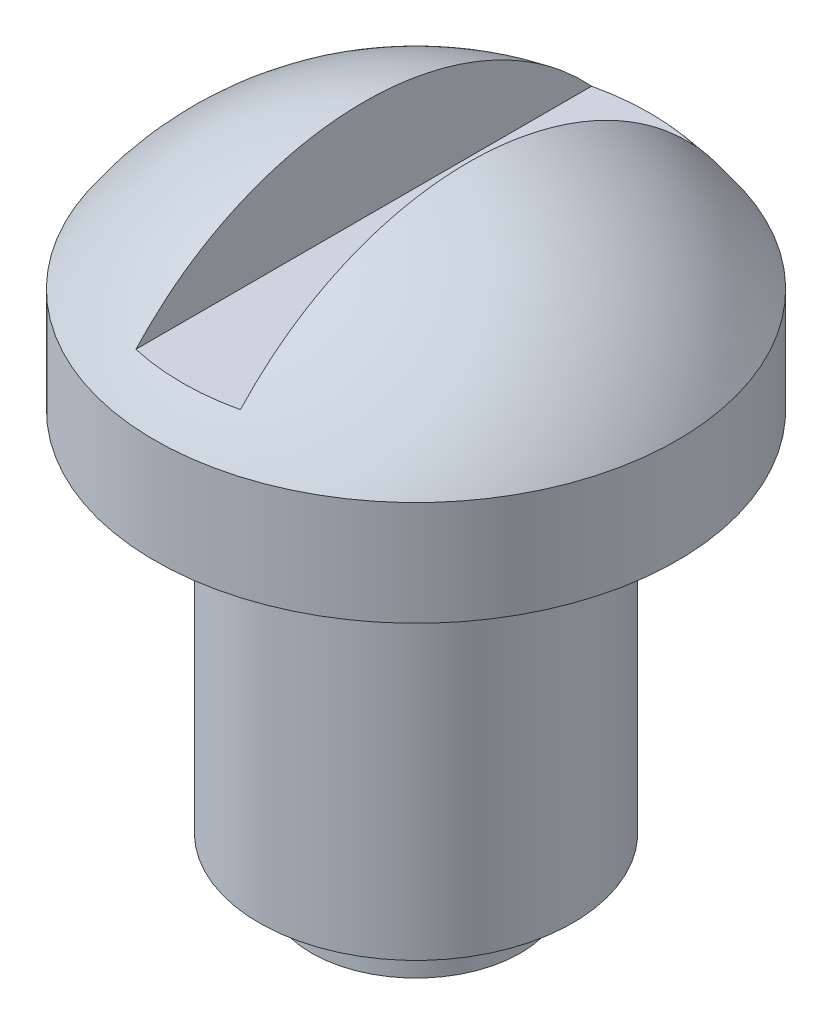
ISO-10303-21;
HEADER;
FILE_DESCRIPTION(('STEP AP214'),'2;1');
FILE_NAME('part.step','',(''),(''),'','','');
FILE_SCHEMA(('AUTOMOTIVE_DESIGN { 1 0 10303 214 1 1 1 1 }'));
ENDSEC;
DATA;
#1=APPLICATION_CONTEXT('core data for automotive mechanical design processes');
#2=APPLICATION_PROTOCOL_DEFINITION('international standard','automotive_design',2000,#1);
#3=PRODUCT_CONTEXT('',#1,'mechanical');
#4=PRODUCT('Part','Part','',(#3));
#5=PRODUCT_RELATED_PRODUCT_CATEGORY('part','',(#4));
#6=PRODUCT_DEFINITION_FORMATION('','',#4);
#7=PRODUCT_DEFINITION_CONTEXT('part definition',#1,'design');
#8=PRODUCT_DEFINITION('design','',#6,#7);
#9=PRODUCT_DEFINITION_SHAPE('','',#8);
#10=(LENGTH_UNIT() NAMED_UNIT(*) SI_UNIT(.MILLI.,.METRE.));
#11=(NAMED_UNIT(*) PLANE_ANGLE_UNIT() SI_UNIT($,.RADIAN.));
#12=(NAMED_UNIT(*) SI_UNIT($,.STERADIAN.) SOLID_ANGLE_UNIT());
#13=UNCERTAINTY_MEASURE_WITH_UNIT(LENGTH_MEASURE(1.E-05),#10,'distance_accuracy_value','');
#14=(GEOMETRIC_REPRESENTATION_CONTEXT(3) GLOBAL_UNCERTAINTY_ASSIGNED_CONTEXT((#13)) GLOBAL_UNIT_ASSIGNED_CONTEXT((#10,
#11,#12)) REPRESENTATION_CONTEXT('',''));
#15=CARTESIAN_POINT('',(0.,0.,0.));
#16=DIRECTION('',(0.,0.,1.));
#17=DIRECTION('',(1.,0.,0.));
#18=AXIS2_PLACEMENT_3D('',#15,#16,#17);
#19=CARTESIAN_POINT('',(0.,-6.,0.));
#20=DIRECTION('',(0.,1.,0.));
#21=DIRECTION('',(1.,0.,0.));
#22=AXIS2_PLACEMENT_3D('',#19,#20,#21);
#23=SPHERICAL_SURFACE('',#22,6.);
#24=CARTESIAN_POINT('',(0.,-2.,0.));
#25=DIRECTION('',(0.,-1.,0.));
#26=DIRECTION('',(0.,0.,-1.));
#27=AXIS2_PLACEMENT_3D('',#24,#25,#26);
#28=CIRCLE('',#27,4.47213595499958);
#29=CARTESIAN_POINT('',(-1.,-2.,-4.35889894354067));
#30=VERTEX_POINT('',#29);
#31=CARTESIAN_POINT('',(1.,-2.,-4.35889894354067));
#32=VERTEX_POINT('',#31);
#33=EDGE_CURVE('E71',#30,#32,#28,.T.);
#34=ORIENTED_EDGE('',*,*,#33,.T.);
#35=CARTESIAN_POINT('',(1.,-6.,0.));
#36=DIRECTION('',(1.,0.,0.));
#37=DIRECTION('',(0.,1.,0.));
#38=AXIS2_PLACEMENT_3D('',#35,#36,#37);
#39=CIRCLE('',#38,5.91607978309962);
#40=CARTESIAN_POINT('',(1.,-2.,4.35889894354067));
#41=VERTEX_POINT('',#40);
#42=EDGE_CURVE('E11',#32,#41,#39,.T.);
#43=ORIENTED_EDGE('',*,*,#42,.T.);
#44=CARTESIAN_POINT('',(-1.,-2.,4.35889894354067));
#45=VERTEX_POINT('',#44);
#46=EDGE_CURVE('E47',#41,#45,#28,.T.);
#47=ORIENTED_EDGE('',*,*,#46,.T.);
#48=CARTESIAN_POINT('',(-1.,-6.,0.));
#49=DIRECTION('',(-1.,0.,0.));
#50=DIRECTION('',(0.,-1.,0.));
#51=AXIS2_PLACEMENT_3D('',#48,#49,#50);
#52=CIRCLE('',#51,5.91607978309962);
#53=EDGE_CURVE('E66',#45,#30,#52,.T.);
#54=ORIENTED_EDGE('',*,*,#53,.T.);
#55=EDGE_LOOP('',(#34,#43,#47,#54));
#56=FACE_BOUND('',#55,.T.);
#57=CARTESIAN_POINT('',(0.,-2.6833752096446,0.));
#58=DIRECTION('',(0.,1.,0.));
#59=DIRECTION('',(-1.,0.,0.));
#60=AXIS2_PLACEMENT_3D('',#57,#58,#59);
#61=CIRCLE('',#60,5.);
#62=CARTESIAN_POINT('',(-5.,-2.6833752096446,0.));
#63=VERTEX_POINT('',#62);
#64=EDGE_CURVE('E72',#63,#63,#61,.T.);
#65=ORIENTED_EDGE('',*,*,#64,.T.);
#66=EDGE_LOOP('',(#65));
#67=FACE_BOUND('',#66,.T.);
#68=ADVANCED_FACE('F39',(#56,#67),#23,.T.);
#69=CARTESIAN_POINT('',(0.,0.,0.));
#70=DIRECTION('',(0.,1.,0.));
#71=DIRECTION('',(-1.,0.,0.));
#72=AXIS2_PLACEMENT_3D('',#69,#70,#71);
#73=CYLINDRICAL_SURFACE('',#72,5.);
#74=ORIENTED_EDGE('',*,*,#64,.F.);
#75=EDGE_LOOP('',(#74));
#76=FACE_BOUND('',#75,.T.);
#77=CARTESIAN_POINT('',(0.,-4.6833752096446,0.));
#78=DIRECTION('',(0.,1.,0.));
#79=DIRECTION('',(-1.,0.,0.));
#80=AXIS2_PLACEMENT_3D('',#77,#78,#79);
#81=CIRCLE('',#80,5.);
#82=CARTESIAN_POINT('',(-5.,-4.6833752096446,0.));
#83=VERTEX_POINT('',#82);
#84=EDGE_CURVE('E85',#83,#83,#81,.T.);
#85=ORIENTED_EDGE('',*,*,#84,.T.);
#86=EDGE_LOOP('',(#85));
#87=FACE_BOUND('',#86,.T.);
#88=ADVANCED_FACE('F121',(#76,#87),#73,.T.);
#89=CARTESIAN_POINT('',(3.,-4.6833752096446,0.));
#90=DIRECTION('',(0.,1.,0.));
#91=DIRECTION('',(-1.,0.,0.));
#92=AXIS2_PLACEMENT_3D('',#89,#90,#91);
#93=PLANE('',#92);
#94=ORIENTED_EDGE('',*,*,#84,.F.);
#95=EDGE_LOOP('',(#94));
#96=FACE_BOUND('',#95,.T.);
#97=CARTESIAN_POINT('',(0.,-4.6833752096446,0.));
#98=DIRECTION('',(0.,1.,0.));
#99=DIRECTION('',(-1.,0.,0.));
#100=AXIS2_PLACEMENT_3D('',#97,#98,#99);
#101=CIRCLE('',#100,3.);
#102=CARTESIAN_POINT('',(-3.,-4.6833752096446,0.));
#103=VERTEX_POINT('',#102);
#104=EDGE_CURVE('E89',#103,#103,#101,.T.);
#105=ORIENTED_EDGE('',*,*,#104,.T.);
#106=EDGE_LOOP('',(#105));
#107=FACE_BOUND('',#106,.T.);
#108=ADVANCED_FACE('F125',(#96,#107),#93,.F.);
#109=CARTESIAN_POINT('',(0.,0.,0.));
#110=DIRECTION('',(0.,1.,0.));
#111=DIRECTION('',(-1.,0.,0.));
#112=AXIS2_PLACEMENT_3D('',#109,#110,#111);
#113=CYLINDRICAL_SURFACE('',#112,3.);
#114=ORIENTED_EDGE('',*,*,#104,.F.);
#115=EDGE_LOOP('',(#114));
#116=FACE_BOUND('',#115,.T.);
#117=CARTESIAN_POINT('',(0.,-11.6833752096446,0.));
#118=DIRECTION('',(0.,1.,0.));
#119=DIRECTION('',(-1.,0.,0.));
#120=AXIS2_PLACEMENT_3D('',#117,#118,#119);
#121=CIRCLE('',#120,3.);
#122=CARTESIAN_POINT('',(-3.,-11.6833752096446,0.));
#123=VERTEX_POINT('',#122);
#124=EDGE_CURVE('E93',#123,#123,#121,.T.);
#125=ORIENTED_EDGE('',*,*,#124,.T.);
#126=EDGE_LOOP('',(#125));
#127=FACE_BOUND('',#126,.T.);
#128=ADVANCED_FACE('F130',(#116,#127),#113,.T.);
#129=CARTESIAN_POINT('',(2.,-11.6833752096446,0.));
#130=DIRECTION('',(0.,1.,0.));
#131=DIRECTION('',(-1.,0.,0.));
#132=AXIS2_PLACEMENT_3D('',#129,#130,#131);
#133=PLANE('',#132);
#134=ORIENTED_EDGE('',*,*,#124,.F.);
#135=EDGE_LOOP('',(#134));
#136=FACE_BOUND('',#135,.T.);
#137=CARTESIAN_POINT('',(0.,-11.6833752096446,0.));
#138=DIRECTION('',(0.,1.,0.));
#139=DIRECTION('',(-1.,0.,0.));
#140=AXIS2_PLACEMENT_3D('',#137,#138,#139);
#141=CIRCLE('',#140,2.);
#142=CARTESIAN_POINT('',(-2.,-11.6833752096446,0.));
#143=VERTEX_POINT('',#142);
#144=EDGE_CURVE('E97',#143,#143,#141,.T.);
#145=ORIENTED_EDGE('',*,*,#144,.T.);
#146=EDGE_LOOP('',(#145));
#147=FACE_BOUND('',#146,.T.);
#148=ADVANCED_FACE('F138',(#136,#147),#133,.F.);
#149=CARTESIAN_POINT('',(0.,0.,0.));
#150=DIRECTION('',(0.,1.,0.));
#151=DIRECTION('',(-1.,0.,0.));
#152=AXIS2_PLACEMENT_3D('',#149,#150,#151);
#153=CYLINDRICAL_SURFACE('',#152,2.);
#154=ORIENTED_EDGE('',*,*,#144,.F.);
#155=EDGE_LOOP('',(#154));
#156=FACE_BOUND('',#155,.T.);
#157=CARTESIAN_POINT('',(0.,-12.6833752096446,0.));
#158=DIRECTION('',(0.,1.,0.));
#159=DIRECTION('',(-1.,0.,0.));
#160=AXIS2_PLACEMENT_3D('',#157,#158,#159);
#161=CIRCLE('',#160,2.);
#162=CARTESIAN_POINT('',(-2.,-12.6833752096446,0.));
#163=VERTEX_POINT('',#162);
#164=EDGE_CURVE('E101',#163,#163,#161,.T.);
#165=ORIENTED_EDGE('',*,*,#164,.T.);
#166=EDGE_LOOP('',(#165));
#167=FACE_BOUND('',#166,.T.);
#168=ADVANCED_FACE('F116',(#156,#167),#153,.T.);
#169=CARTESIAN_POINT('',(0.,-12.6833752096446,0.));
#170=DIRECTION('',(0.,1.,0.));
#171=DIRECTION('',(-1.,0.,0.));
#172=AXIS2_PLACEMENT_3D('',#169,#170,#171);
#173=PLANE('',#172);
#174=ORIENTED_EDGE('',*,*,#164,.F.);
#175=EDGE_LOOP('',(#174));
#176=FACE_BOUND('',#175,.T.);
#177=ADVANCED_FACE('F109',(#176),#173,.F.);
#178=CARTESIAN_POINT('',(1.,2.,-5.));
#179=DIRECTION('',(1.,0.,0.));
#180=DIRECTION('',(0.,1.,0.));
#181=AXIS2_PLACEMENT_3D('',#178,#179,#180);
#182=PLANE('',#181);
#183=DIRECTION('',(0.,0.,1.));
#184=VECTOR('',#183,1.);
#185=CARTESIAN_POINT('',(1.,-2.,-5.));
#186=LINE('',#185,#184);
#187=EDGE_CURVE('E76',#32,#41,#186,.T.);
#188=ORIENTED_EDGE('',*,*,#187,.T.);
#189=ORIENTED_EDGE('',*,*,#42,.F.);
#190=EDGE_LOOP('',(#188,#189));
#191=FACE_BOUND('',#190,.T.);
#192=ADVANCED_FACE('F107',(#191),#182,.F.);
#193=CARTESIAN_POINT('',(-1.,-2.,-5.));
#194=DIRECTION('',(0.,-1.,0.));
#195=DIRECTION('',(0.,0.,-1.));
#196=AXIS2_PLACEMENT_3D('',#193,#194,#195);
#197=PLANE('',#196);
#198=ORIENTED_EDGE('',*,*,#187,.F.);
#199=ORIENTED_EDGE('',*,*,#33,.F.);
#200=DIRECTION('',(0.,0.,1.));
#201=VECTOR('',#200,1.);
#202=CARTESIAN_POINT('',(-1.,-2.,-5.));
#203=LINE('',#202,#201);
#204=EDGE_CURVE('E53',#30,#45,#203,.T.);
#205=ORIENTED_EDGE('',*,*,#204,.T.);
#206=ORIENTED_EDGE('',*,*,#46,.F.);
#207=EDGE_LOOP('',(#198,#199,#205,#206));
#208=FACE_BOUND('',#207,.T.);
#209=ADVANCED_FACE('F74',(#208),#197,.F.);
#210=CARTESIAN_POINT('',(-1.,2.,-5.));
#211=DIRECTION('',(-1.,0.,0.));
#212=DIRECTION('',(0.,-1.,0.));
#213=AXIS2_PLACEMENT_3D('',#210,#211,#212);
#214=PLANE('',#213);
#215=ORIENTED_EDGE('',*,*,#204,.F.);
#216=ORIENTED_EDGE('',*,*,#53,.F.);
#217=EDGE_LOOP('',(#215,#216));
#218=FACE_BOUND('',#217,.T.);
#219=ADVANCED_FACE('F67',(#218),#214,.F.);
#220=CLOSED_SHELL('',(#68,#88,#108,#128,#148,#168,#177,#192,#209,#219));
#221=MANIFOLD_SOLID_BREP('B2',#220);
#222=ADVANCED_BREP_SHAPE_REPRESENTATION('',(#18,#221),#14);
#223=SHAPE_DEFINITION_REPRESENTATION(#9,#222);
ENDSEC;
END-ISO-10303-21;
